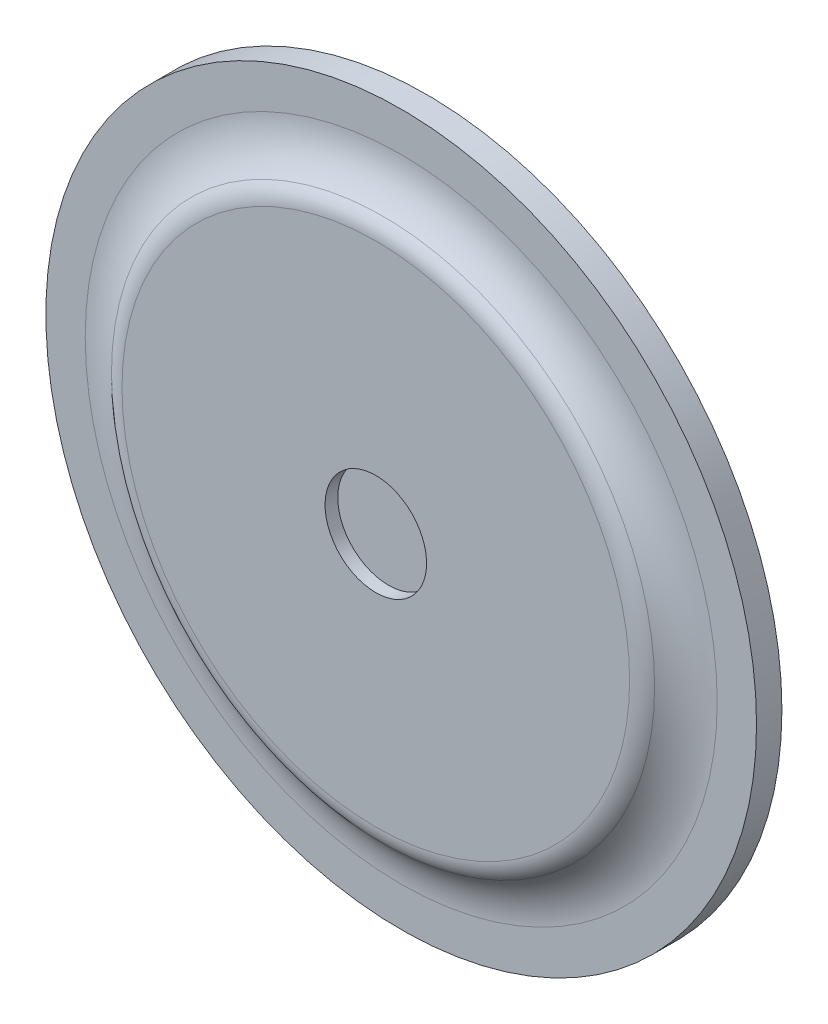
ISO-10303-21;
HEADER;
FILE_DESCRIPTION(('STEP AP214'),'2;1');
FILE_NAME('part.step','',(''),(''),'','','');
FILE_SCHEMA(('AUTOMOTIVE_DESIGN { 1 0 10303 214 1 1 1 1 }'));
ENDSEC;
DATA;
#1=APPLICATION_CONTEXT('core data for automotive mechanical design processes');
#2=APPLICATION_PROTOCOL_DEFINITION('international standard','automotive_design',2000,#1);
#3=PRODUCT_CONTEXT('',#1,'mechanical');
#4=PRODUCT('Part','Part','',(#3));
#5=PRODUCT_RELATED_PRODUCT_CATEGORY('part','',(#4));
#6=PRODUCT_DEFINITION_FORMATION('','',#4);
#7=PRODUCT_DEFINITION_CONTEXT('part definition',#1,'design');
#8=PRODUCT_DEFINITION('design','',#6,#7);
#9=PRODUCT_DEFINITION_SHAPE('','',#8);
#10=(LENGTH_UNIT() NAMED_UNIT(*) SI_UNIT(.MILLI.,.METRE.));
#11=(NAMED_UNIT(*) PLANE_ANGLE_UNIT() SI_UNIT($,.RADIAN.));
#12=(NAMED_UNIT(*) SI_UNIT($,.STERADIAN.) SOLID_ANGLE_UNIT());
#13=UNCERTAINTY_MEASURE_WITH_UNIT(LENGTH_MEASURE(1.E-05),#10,'distance_accuracy_value','');
#14=(GEOMETRIC_REPRESENTATION_CONTEXT(3) GLOBAL_UNCERTAINTY_ASSIGNED_CONTEXT((#13)) GLOBAL_UNIT_ASSIGNED_CONTEXT((#10,
#11,#12)) REPRESENTATION_CONTEXT('',''));
#15=CARTESIAN_POINT('',(0.,0.,0.));
#16=DIRECTION('',(0.,0.,1.));
#17=DIRECTION('',(1.,0.,0.));
#18=AXIS2_PLACEMENT_3D('',#15,#16,#17);
#19=CARTESIAN_POINT('',(0.,0.,28.575));
#20=DIRECTION('',(0.,0.,1.));
#21=DIRECTION('',(1.,0.,0.));
#22=AXIS2_PLACEMENT_3D('',#19,#20,#21);
#23=TOROIDAL_SURFACE('',#22,31.75,3.175);
#24=CARTESIAN_POINT('',(0.,0.,30.8428571428571));
#25=DIRECTION('',(0.,0.,1.));
#26=DIRECTION('',(1.,0.,0.));
#27=AXIS2_PLACEMENT_3D('',#24,#25,#26);
#28=CIRCLE('',#27,33.9720371238105);
#29=CARTESIAN_POINT('',(33.9720371238105,0.,30.8428571428571));
#30=VERTEX_POINT('',#29);
#31=EDGE_CURVE('E60',#30,#30,#28,.T.);
#32=ORIENTED_EDGE('',*,*,#31,.T.);
#33=EDGE_LOOP('',(#32));
#34=FACE_BOUND('',#33,.T.);
#35=CARTESIAN_POINT('',(0.,0.,31.75));
#36=DIRECTION('',(0.,0.,1.));
#37=DIRECTION('',(1.,0.,0.));
#38=AXIS2_PLACEMENT_3D('',#35,#36,#37);
#39=CIRCLE('',#38,31.75);
#40=CARTESIAN_POINT('',(31.75,0.,31.75));
#41=VERTEX_POINT('',#40);
#42=EDGE_CURVE('E10',#41,#41,#39,.T.);
#43=ORIENTED_EDGE('',*,*,#42,.F.);
#44=EDGE_LOOP('',(#43));
#45=FACE_BOUND('',#44,.T.);
#46=ADVANCED_FACE('F35',(#34,#45),#23,.T.);
#47=CARTESIAN_POINT('',(0.,0.,31.75));
#48=DIRECTION('',(0.,0.,-1.));
#49=DIRECTION('',(-1.,0.,0.));
#50=AXIS2_PLACEMENT_3D('',#47,#48,#49);
#51=PLANE('',#50);
#52=CARTESIAN_POINT('',(0.,0.,31.75));
#53=DIRECTION('',(0.,0.,1.));
#54=DIRECTION('',(0.,-1.,0.));
#55=AXIS2_PLACEMENT_3D('',#52,#53,#54);
#56=CIRCLE('',#55,6.34999999999999);
#57=CARTESIAN_POINT('',(0.,-6.34999999999999,31.75));
#58=VERTEX_POINT('',#57);
#59=EDGE_CURVE('E63',#58,#58,#56,.T.);
#60=ORIENTED_EDGE('',*,*,#59,.F.);
#61=EDGE_LOOP('',(#60));
#62=FACE_BOUND('',#61,.T.);
#63=ORIENTED_EDGE('',*,*,#42,.T.);
#64=EDGE_LOOP('',(#63));
#65=FACE_BOUND('',#64,.T.);
#66=ADVANCED_FACE('F119',(#62,#65),#51,.F.);
#67=CARTESIAN_POINT('',(0.,0.,21.59));
#68=DIRECTION('',(0.,0.,-1.));
#69=DIRECTION('',(-1.,0.,0.));
#70=AXIS2_PLACEMENT_3D('',#67,#68,#69);
#71=PLANE('',#70);
#72=CARTESIAN_POINT('',(-2.74963065701559,1.5875,21.59));
#73=DIRECTION('',(0.,0.,-1.));
#74=DIRECTION('',(-1.,0.,0.));
#75=AXIS2_PLACEMENT_3D('',#72,#73,#74);
#76=CIRCLE('',#75,0.79375);
#77=CARTESIAN_POINT('',(-3.54338065701559,1.5875,21.59));
#78=VERTEX_POINT('',#77);
#79=EDGE_CURVE('E99',#78,#78,#76,.T.);
#80=ORIENTED_EDGE('',*,*,#79,.F.);
#81=EDGE_LOOP('',(#80));
#82=FACE_BOUND('',#81,.T.);
#83=CARTESIAN_POINT('',(-2.74963065701559,-1.5875,21.59));
#84=DIRECTION('',(0.,0.,-1.));
#85=DIRECTION('',(-1.,0.,0.));
#86=AXIS2_PLACEMENT_3D('',#83,#84,#85);
#87=CIRCLE('',#86,0.79375);
#88=CARTESIAN_POINT('',(-3.54338065701559,-1.5875,21.59));
#89=VERTEX_POINT('',#88);
#90=EDGE_CURVE('E93',#89,#89,#87,.T.);
#91=ORIENTED_EDGE('',*,*,#90,.F.);
#92=EDGE_LOOP('',(#91));
#93=FACE_BOUND('',#92,.T.);
#94=CARTESIAN_POINT('',(0.,-3.175,21.59));
#95=DIRECTION('',(0.,0.,-1.));
#96=DIRECTION('',(-1.,0.,0.));
#97=AXIS2_PLACEMENT_3D('',#94,#95,#96);
#98=CIRCLE('',#97,0.79375);
#99=CARTESIAN_POINT('',(-0.79375,-3.175,21.59));
#100=VERTEX_POINT('',#99);
#101=EDGE_CURVE('E85',#100,#100,#98,.T.);
#102=ORIENTED_EDGE('',*,*,#101,.F.);
#103=EDGE_LOOP('',(#102));
#104=FACE_BOUND('',#103,.T.);
#105=CARTESIAN_POINT('',(2.74963065701559,-1.5875,21.59));
#106=DIRECTION('',(0.,0.,-1.));
#107=DIRECTION('',(-1.,0.,0.));
#108=AXIS2_PLACEMENT_3D('',#105,#106,#107);
#109=CIRCLE('',#108,0.79375);
#110=CARTESIAN_POINT('',(1.95588065701559,-1.5875,21.59));
#111=VERTEX_POINT('',#110);
#112=EDGE_CURVE('E86',#111,#111,#109,.T.);
#113=ORIENTED_EDGE('',*,*,#112,.F.);
#114=EDGE_LOOP('',(#113));
#115=FACE_BOUND('',#114,.T.);
#116=CARTESIAN_POINT('',(2.74963065701559,1.5875,21.59));
#117=DIRECTION('',(0.,0.,-1.));
#118=DIRECTION('',(-1.,0.,0.));
#119=AXIS2_PLACEMENT_3D('',#116,#117,#118);
#120=CIRCLE('',#119,0.79375);
#121=CARTESIAN_POINT('',(1.95588065701559,1.5875,21.59));
#122=VERTEX_POINT('',#121);
#123=EDGE_CURVE('E108',#122,#122,#120,.T.);
#124=ORIENTED_EDGE('',*,*,#123,.F.);
#125=EDGE_LOOP('',(#124));
#126=FACE_BOUND('',#125,.T.);
#127=CARTESIAN_POINT('',(0.,3.175,21.59));
#128=DIRECTION('',(0.,0.,-1.));
#129=DIRECTION('',(-1.,0.,0.));
#130=AXIS2_PLACEMENT_3D('',#127,#128,#129);
#131=CIRCLE('',#130,0.79375);
#132=CARTESIAN_POINT('',(-0.79375,3.175,21.59));
#133=VERTEX_POINT('',#132);
#134=EDGE_CURVE('E78',#133,#133,#131,.T.);
#135=ORIENTED_EDGE('',*,*,#134,.F.);
#136=EDGE_LOOP('',(#135));
#137=FACE_BOUND('',#136,.T.);
#138=CARTESIAN_POINT('',(0.,0.,21.59));
#139=DIRECTION('',(0.,0.,1.));
#140=DIRECTION('',(1.,0.,0.));
#141=AXIS2_PLACEMENT_3D('',#138,#139,#140);
#142=CIRCLE('',#141,26.9875);
#143=CARTESIAN_POINT('',(26.9875,0.,21.59));
#144=VERTEX_POINT('',#143);
#145=EDGE_CURVE('E41',#144,#144,#142,.T.);
#146=ORIENTED_EDGE('',*,*,#145,.F.);
#147=EDGE_LOOP('',(#146));
#148=FACE_BOUND('',#147,.T.);
#149=ADVANCED_FACE('F115',(#82,#93,#104,#115,#126,#137,#148),#71,.T.);
#150=CARTESIAN_POINT('',(0.,0.,31.75));
#151=DIRECTION('',(0.,0.,1.));
#152=DIRECTION('',(1.,0.,0.));
#153=AXIS2_PLACEMENT_3D('',#150,#151,#152);
#154=CYLINDRICAL_SURFACE('',#153,26.9875);
#155=ORIENTED_EDGE('',*,*,#145,.T.);
#156=EDGE_LOOP('',(#155));
#157=FACE_BOUND('',#156,.T.);
#158=CARTESIAN_POINT('',(0.,0.,25.4));
#159=DIRECTION('',(0.,0.,1.));
#160=DIRECTION('',(1.,0.,0.));
#161=AXIS2_PLACEMENT_3D('',#158,#159,#160);
#162=CIRCLE('',#161,26.9875);
#163=CARTESIAN_POINT('',(26.9875,0.,25.4));
#164=VERTEX_POINT('',#163);
#165=EDGE_CURVE('E45',#164,#164,#162,.T.);
#166=ORIENTED_EDGE('',*,*,#165,.F.);
#167=EDGE_LOOP('',(#166));
#168=FACE_BOUND('',#167,.T.);
#169=ADVANCED_FACE('F118',(#157,#168),#154,.T.);
#170=CARTESIAN_POINT('',(0.,0.,25.4));
#171=DIRECTION('',(0.,0.,-1.));
#172=DIRECTION('',(-1.,0.,0.));
#173=AXIS2_PLACEMENT_3D('',#170,#171,#172);
#174=PLANE('',#173);
#175=ORIENTED_EDGE('',*,*,#165,.T.);
#176=EDGE_LOOP('',(#175));
#177=FACE_BOUND('',#176,.T.);
#178=CARTESIAN_POINT('',(0.,0.,25.4));
#179=DIRECTION('',(0.,0.,1.));
#180=DIRECTION('',(1.,0.,0.));
#181=AXIS2_PLACEMENT_3D('',#178,#179,#180);
#182=CIRCLE('',#181,44.45);
#183=CARTESIAN_POINT('',(44.45,0.,25.4));
#184=VERTEX_POINT('',#183);
#185=EDGE_CURVE('E49',#184,#184,#182,.T.);
#186=ORIENTED_EDGE('',*,*,#185,.F.);
#187=EDGE_LOOP('',(#186));
#188=FACE_BOUND('',#187,.T.);
#189=ADVANCED_FACE('F172',(#177,#188),#174,.T.);
#190=CARTESIAN_POINT('',(0.,0.,31.75));
#191=DIRECTION('',(0.,0.,1.));
#192=DIRECTION('',(1.,0.,0.));
#193=AXIS2_PLACEMENT_3D('',#190,#191,#192);
#194=CYLINDRICAL_SURFACE('',#193,44.45);
#195=ORIENTED_EDGE('',*,*,#185,.T.);
#196=EDGE_LOOP('',(#195));
#197=FACE_BOUND('',#196,.T.);
#198=CARTESIAN_POINT('',(0.,0.,28.575));
#199=DIRECTION('',(0.,0.,1.));
#200=DIRECTION('',(1.,0.,0.));
#201=AXIS2_PLACEMENT_3D('',#198,#199,#200);
#202=CIRCLE('',#201,44.45);
#203=CARTESIAN_POINT('',(44.45,0.,28.575));
#204=VERTEX_POINT('',#203);
#205=EDGE_CURVE('E54',#204,#204,#202,.T.);
#206=ORIENTED_EDGE('',*,*,#205,.F.);
#207=EDGE_LOOP('',(#206));
#208=FACE_BOUND('',#207,.T.);
#209=ADVANCED_FACE('F166',(#197,#208),#194,.T.);
#210=CARTESIAN_POINT('',(0.,0.,28.575));
#211=DIRECTION('',(0.,0.,1.));
#212=DIRECTION('',(1.,0.,0.));
#213=AXIS2_PLACEMENT_3D('',#210,#211,#212);
#214=PLANE('',#213);
#215=ORIENTED_EDGE('',*,*,#205,.T.);
#216=EDGE_LOOP('',(#215));
#217=FACE_BOUND('',#216,.T.);
#218=CARTESIAN_POINT('',(0.,0.,28.575));
#219=DIRECTION('',(0.,0.,1.));
#220=DIRECTION('',(1.,0.,0.));
#221=AXIS2_PLACEMENT_3D('',#218,#219,#220);
#222=CIRCLE('',#221,39.5271299333366);
#223=CARTESIAN_POINT('',(39.5271299333366,0.,28.575));
#224=VERTEX_POINT('',#223);
#225=EDGE_CURVE('E57',#224,#224,#222,.T.);
#226=ORIENTED_EDGE('',*,*,#225,.F.);
#227=EDGE_LOOP('',(#226));
#228=FACE_BOUND('',#227,.T.);
#229=ADVANCED_FACE('F161',(#217,#228),#214,.T.);
#230=CARTESIAN_POINT('',(0.,0.,36.5125));
#231=DIRECTION('',(0.,0.,1.));
#232=DIRECTION('',(1.,0.,0.));
#233=AXIS2_PLACEMENT_3D('',#230,#231,#232);
#234=TOROIDAL_SURFACE('',#233,39.5271299333366,7.9375);
#235=ORIENTED_EDGE('',*,*,#31,.F.);
#236=EDGE_LOOP('',(#235));
#237=FACE_BOUND('',#236,.T.);
#238=ORIENTED_EDGE('',*,*,#225,.T.);
#239=EDGE_LOOP('',(#238));
#240=FACE_BOUND('',#239,.T.);
#241=ADVANCED_FACE('F158',(#237,#240),#234,.F.);
#242=CARTESIAN_POINT('',(0.,0.,31.75));
#243=DIRECTION('',(0.,0.,1.));
#244=DIRECTION('',(0.,-1.,0.));
#245=AXIS2_PLACEMENT_3D('',#242,#243,#244);
#246=CYLINDRICAL_SURFACE('',#245,6.35);
#247=ORIENTED_EDGE('',*,*,#59,.T.);
#248=EDGE_LOOP('',(#247));
#249=FACE_BOUND('',#248,.T.);
#250=CARTESIAN_POINT('',(0.,0.,30.1625));
#251=DIRECTION('',(0.,0.,1.));
#252=DIRECTION('',(0.,-1.,0.));
#253=AXIS2_PLACEMENT_3D('',#250,#251,#252);
#254=CIRCLE('',#253,6.35);
#255=CARTESIAN_POINT('',(0.,-6.35,30.1625));
#256=VERTEX_POINT('',#255);
#257=EDGE_CURVE('E72',#256,#256,#254,.T.);
#258=ORIENTED_EDGE('',*,*,#257,.F.);
#259=EDGE_LOOP('',(#258));
#260=FACE_BOUND('',#259,.T.);
#261=ADVANCED_FACE('F136',(#249,#260),#246,.F.);
#262=CARTESIAN_POINT('',(0.,25.4,23.1775));
#263=DIRECTION('',(0.,0.,1.));
#264=DIRECTION('',(0.,-1.,0.));
#265=AXIS2_PLACEMENT_3D('',#262,#263,#264);
#266=PLANE('',#265);
#267=CARTESIAN_POINT('',(-2.74963065701559,1.5875,23.1775));
#268=DIRECTION('',(0.,0.,1.));
#269=DIRECTION('',(0.,-1.,0.));
#270=AXIS2_PLACEMENT_3D('',#267,#268,#269);
#271=CIRCLE('',#270,0.79375);
#272=CARTESIAN_POINT('',(-2.74963065701559,0.793750000000001,23.1775));
#273=VERTEX_POINT('',#272);
#274=EDGE_CURVE('E81',#273,#273,#271,.F.);
#275=ORIENTED_EDGE('',*,*,#274,.T.);
#276=EDGE_LOOP('',(#275));
#277=FACE_BOUND('',#276,.T.);
#278=CARTESIAN_POINT('',(-2.74963065701559,-1.5875,23.1775));
#279=DIRECTION('',(0.,0.,1.));
#280=DIRECTION('',(0.,-1.,0.));
#281=AXIS2_PLACEMENT_3D('',#278,#279,#280);
#282=CIRCLE('',#281,0.79375);
#283=CARTESIAN_POINT('',(-2.74963065701559,-2.38125,23.1775));
#284=VERTEX_POINT('',#283);
#285=EDGE_CURVE('E96',#284,#284,#282,.F.);
#286=ORIENTED_EDGE('',*,*,#285,.T.);
#287=EDGE_LOOP('',(#286));
#288=FACE_BOUND('',#287,.T.);
#289=CARTESIAN_POINT('',(0.,-3.175,23.1775));
#290=DIRECTION('',(0.,0.,1.));
#291=DIRECTION('',(0.,-1.,0.));
#292=AXIS2_PLACEMENT_3D('',#289,#290,#291);
#293=CIRCLE('',#292,0.79375);
#294=CARTESIAN_POINT('',(0.,-3.96875,23.1775));
#295=VERTEX_POINT('',#294);
#296=EDGE_CURVE('E90',#295,#295,#293,.F.);
#297=ORIENTED_EDGE('',*,*,#296,.T.);
#298=EDGE_LOOP('',(#297));
#299=FACE_BOUND('',#298,.T.);
#300=CARTESIAN_POINT('',(2.74963065701559,-1.5875,23.1775));
#301=DIRECTION('',(0.,0.,1.));
#302=DIRECTION('',(0.,-1.,0.));
#303=AXIS2_PLACEMENT_3D('',#300,#301,#302);
#304=CIRCLE('',#303,0.79375);
#305=CARTESIAN_POINT('',(2.74963065701559,-2.38125,23.1775));
#306=VERTEX_POINT('',#305);
#307=EDGE_CURVE('E82',#306,#306,#304,.F.);
#308=ORIENTED_EDGE('',*,*,#307,.T.);
#309=EDGE_LOOP('',(#308));
#310=FACE_BOUND('',#309,.T.);
#311=CARTESIAN_POINT('',(2.74963065701559,1.5875,23.1775));
#312=DIRECTION('',(0.,0.,1.));
#313=DIRECTION('',(0.,-1.,0.));
#314=AXIS2_PLACEMENT_3D('',#311,#312,#313);
#315=CIRCLE('',#314,0.79375);
#316=CARTESIAN_POINT('',(2.74963065701559,0.793749999999998,23.1775));
#317=VERTEX_POINT('',#316);
#318=EDGE_CURVE('E89',#317,#317,#315,.F.);
#319=ORIENTED_EDGE('',*,*,#318,.T.);
#320=EDGE_LOOP('',(#319));
#321=FACE_BOUND('',#320,.T.);
#322=CARTESIAN_POINT('',(0.,3.175,23.1775));
#323=DIRECTION('',(0.,0.,1.));
#324=DIRECTION('',(0.,-1.,0.));
#325=AXIS2_PLACEMENT_3D('',#322,#323,#324);
#326=CIRCLE('',#325,0.79375);
#327=CARTESIAN_POINT('',(0.,2.38125,23.1775));
#328=VERTEX_POINT('',#327);
#329=EDGE_CURVE('E75',#328,#328,#326,.F.);
#330=ORIENTED_EDGE('',*,*,#329,.T.);
#331=EDGE_LOOP('',(#330));
#332=FACE_BOUND('',#331,.T.);
#333=CARTESIAN_POINT('',(0.,0.,23.1775));
#334=DIRECTION('',(0.,0.,1.));
#335=DIRECTION('',(0.,-1.,0.));
#336=AXIS2_PLACEMENT_3D('',#333,#334,#335);
#337=CIRCLE('',#336,25.4);
#338=CARTESIAN_POINT('',(0.,-25.4,23.1775));
#339=VERTEX_POINT('',#338);
#340=EDGE_CURVE('E66',#339,#339,#337,.T.);
#341=ORIENTED_EDGE('',*,*,#340,.T.);
#342=EDGE_LOOP('',(#341));
#343=FACE_BOUND('',#342,.T.);
#344=ADVANCED_FACE('F132',(#277,#288,#299,#310,#321,#332,#343),#266,.T.);
#345=CARTESIAN_POINT('',(0.,0.,31.75));
#346=DIRECTION('',(0.,0.,1.));
#347=DIRECTION('',(0.,-1.,0.));
#348=AXIS2_PLACEMENT_3D('',#345,#346,#347);
#349=CYLINDRICAL_SURFACE('',#348,25.4);
#350=CARTESIAN_POINT('',(0.,0.,30.1625));
#351=DIRECTION('',(0.,0.,1.));
#352=DIRECTION('',(0.,-1.,0.));
#353=AXIS2_PLACEMENT_3D('',#350,#351,#352);
#354=CIRCLE('',#353,25.4);
#355=CARTESIAN_POINT('',(0.,-25.4,30.1625));
#356=VERTEX_POINT('',#355);
#357=EDGE_CURVE('E69',#356,#356,#354,.T.);
#358=ORIENTED_EDGE('',*,*,#357,.T.);
#359=EDGE_LOOP('',(#358));
#360=FACE_BOUND('',#359,.T.);
#361=ORIENTED_EDGE('',*,*,#340,.F.);
#362=EDGE_LOOP('',(#361));
#363=FACE_BOUND('',#362,.T.);
#364=ADVANCED_FACE('F135',(#360,#363),#349,.F.);
#365=CARTESIAN_POINT('',(0.,25.4,30.1625));
#366=DIRECTION('',(0.,0.,-1.));
#367=DIRECTION('',(0.,1.,0.));
#368=AXIS2_PLACEMENT_3D('',#365,#366,#367);
#369=PLANE('',#368);
#370=ORIENTED_EDGE('',*,*,#257,.T.);
#371=EDGE_LOOP('',(#370));
#372=FACE_BOUND('',#371,.T.);
#373=ORIENTED_EDGE('',*,*,#357,.F.);
#374=EDGE_LOOP('',(#373));
#375=FACE_BOUND('',#374,.T.);
#376=ADVANCED_FACE('F128',(#372,#375),#369,.T.);
#377=CARTESIAN_POINT('',(0.,3.175,25.4225640302673));
#378=DIRECTION('',(0.,0.,-1.));
#379=DIRECTION('',(-1.,0.,0.));
#380=AXIS2_PLACEMENT_3D('',#377,#378,#379);
#381=CYLINDRICAL_SURFACE('',#380,0.79375);
#382=ORIENTED_EDGE('',*,*,#134,.T.);
#383=EDGE_LOOP('',(#382));
#384=FACE_BOUND('',#383,.T.);
#385=ORIENTED_EDGE('',*,*,#329,.F.);
#386=EDGE_LOOP('',(#385));
#387=FACE_BOUND('',#386,.T.);
#388=ADVANCED_FACE('F125',(#384,#387),#381,.F.);
#389=CARTESIAN_POINT('',(2.74963065701559,1.5875,25.4225640302673));
#390=DIRECTION('',(0.,0.,-1.));
#391=DIRECTION('',(-1.,0.,0.));
#392=AXIS2_PLACEMENT_3D('',#389,#390,#391);
#393=CYLINDRICAL_SURFACE('',#392,0.79375);
#394=ORIENTED_EDGE('',*,*,#123,.T.);
#395=EDGE_LOOP('',(#394));
#396=FACE_BOUND('',#395,.T.);
#397=ORIENTED_EDGE('',*,*,#318,.F.);
#398=EDGE_LOOP('',(#397));
#399=FACE_BOUND('',#398,.T.);
#400=ADVANCED_FACE('F112',(#396,#399),#393,.F.);
#401=CARTESIAN_POINT('',(2.74963065701559,-1.5875,25.4225640302673));
#402=DIRECTION('',(0.,0.,-1.));
#403=DIRECTION('',(-1.,0.,0.));
#404=AXIS2_PLACEMENT_3D('',#401,#402,#403);
#405=CYLINDRICAL_SURFACE('',#404,0.79375);
#406=ORIENTED_EDGE('',*,*,#112,.T.);
#407=EDGE_LOOP('',(#406));
#408=FACE_BOUND('',#407,.T.);
#409=ORIENTED_EDGE('',*,*,#307,.F.);
#410=EDGE_LOOP('',(#409));
#411=FACE_BOUND('',#410,.T.);
#412=ADVANCED_FACE('F259',(#408,#411),#405,.F.);
#413=CARTESIAN_POINT('',(0.,-3.175,25.4225640302673));
#414=DIRECTION('',(0.,0.,-1.));
#415=DIRECTION('',(-1.,0.,0.));
#416=AXIS2_PLACEMENT_3D('',#413,#414,#415);
#417=CYLINDRICAL_SURFACE('',#416,0.79375);
#418=ORIENTED_EDGE('',*,*,#101,.T.);
#419=EDGE_LOOP('',(#418));
#420=FACE_BOUND('',#419,.T.);
#421=ORIENTED_EDGE('',*,*,#296,.F.);
#422=EDGE_LOOP('',(#421));
#423=FACE_BOUND('',#422,.T.);
#424=ADVANCED_FACE('F268',(#420,#423),#417,.F.);
#425=CARTESIAN_POINT('',(-2.74963065701559,-1.5875,25.4225640302673));
#426=DIRECTION('',(0.,0.,-1.));
#427=DIRECTION('',(-1.,0.,0.));
#428=AXIS2_PLACEMENT_3D('',#425,#426,#427);
#429=CYLINDRICAL_SURFACE('',#428,0.79375);
#430=ORIENTED_EDGE('',*,*,#90,.T.);
#431=EDGE_LOOP('',(#430));
#432=FACE_BOUND('',#431,.T.);
#433=ORIENTED_EDGE('',*,*,#285,.F.);
#434=EDGE_LOOP('',(#433));
#435=FACE_BOUND('',#434,.T.);
#436=ADVANCED_FACE('F278',(#432,#435),#429,.F.);
#437=CARTESIAN_POINT('',(-2.74963065701559,1.5875,25.4225640302673));
#438=DIRECTION('',(0.,0.,-1.));
#439=DIRECTION('',(-1.,0.,0.));
#440=AXIS2_PLACEMENT_3D('',#437,#438,#439);
#441=CYLINDRICAL_SURFACE('',#440,0.79375);
#442=ORIENTED_EDGE('',*,*,#79,.T.);
#443=EDGE_LOOP('',(#442));
#444=FACE_BOUND('',#443,.T.);
#445=ORIENTED_EDGE('',*,*,#274,.F.);
#446=EDGE_LOOP('',(#445));
#447=FACE_BOUND('',#446,.T.);
#448=ADVANCED_FACE('F288',(#444,#447),#441,.F.);
#449=CLOSED_SHELL('',(#46,#66,#149,#169,#189,#209,#229,#241,#261,#344,#364,#376,#388,#400,#412,
#424,#436,#448));
#450=MANIFOLD_SOLID_BREP('B2',#449);
#451=ADVANCED_BREP_SHAPE_REPRESENTATION('',(#18,#450),#14);
#452=SHAPE_DEFINITION_REPRESENTATION(#9,#451);
ENDSEC;
END-ISO-10303-21;
